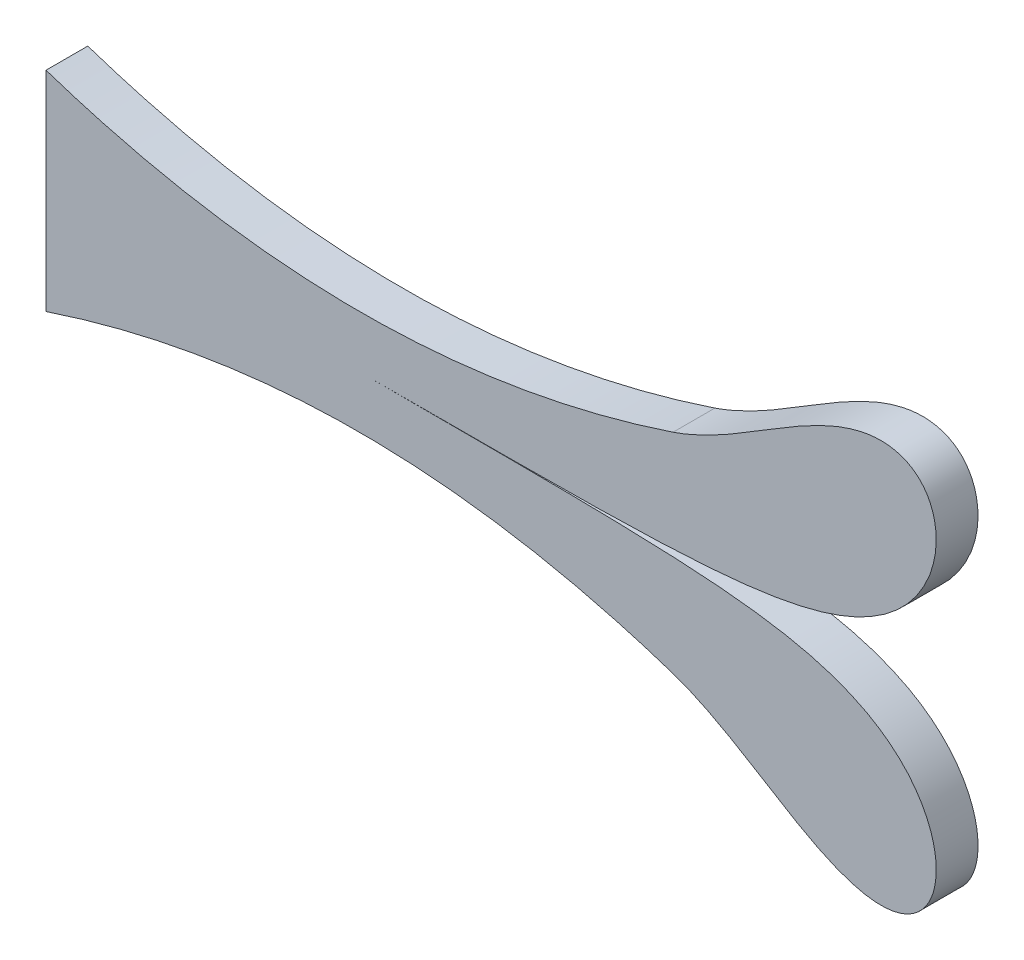
ISO-10303-21;
HEADER;
FILE_DESCRIPTION(('STEP AP214'),'2;1');
FILE_NAME('part.step','',(''),(''),'','','');
FILE_SCHEMA(('AUTOMOTIVE_DESIGN { 1 0 10303 214 1 1 1 1 }'));
ENDSEC;
DATA;
#1=APPLICATION_CONTEXT('core data for automotive mechanical design processes');
#2=APPLICATION_PROTOCOL_DEFINITION('international standard','automotive_design',2000,#1);
#3=PRODUCT_CONTEXT('',#1,'mechanical');
#4=PRODUCT('Part','Part','',(#3));
#5=PRODUCT_RELATED_PRODUCT_CATEGORY('part','',(#4));
#6=PRODUCT_DEFINITION_FORMATION('','',#4);
#7=PRODUCT_DEFINITION_CONTEXT('part definition',#1,'design');
#8=PRODUCT_DEFINITION('design','',#6,#7);
#9=PRODUCT_DEFINITION_SHAPE('','',#8);
#10=(LENGTH_UNIT() NAMED_UNIT(*) SI_UNIT(.MILLI.,.METRE.));
#11=(NAMED_UNIT(*) PLANE_ANGLE_UNIT() SI_UNIT($,.RADIAN.));
#12=(NAMED_UNIT(*) SI_UNIT($,.STERADIAN.) SOLID_ANGLE_UNIT());
#13=UNCERTAINTY_MEASURE_WITH_UNIT(LENGTH_MEASURE(1.E-05),#10,'distance_accuracy_value','');
#14=(GEOMETRIC_REPRESENTATION_CONTEXT(3) GLOBAL_UNCERTAINTY_ASSIGNED_CONTEXT((#13)) GLOBAL_UNIT_ASSIGNED_CONTEXT((#10,
#11,#12)) REPRESENTATION_CONTEXT('',''));
#15=CARTESIAN_POINT('',(0.,0.,0.));
#16=DIRECTION('',(0.,0.,1.));
#17=DIRECTION('',(1.,0.,0.));
#18=AXIS2_PLACEMENT_3D('',#15,#16,#17);
#19=CARTESIAN_POINT('',(-30.,-10.,4.));
#20=CARTESIAN_POINT('',(0.,0.,4.));
#21=CARTESIAN_POINT('',(30.,-10.,4.));
#22=B_SPLINE_CURVE_WITH_KNOTS('',2,(#19,#20,#21),.UNSPECIFIED.,.F.,.F.,(3,3),(0.,1.),.UNSPECIFIED.);
#23=DIRECTION('',(0.,0.,-1.));
#24=VECTOR('',#23,1.);
#25=SURFACE_OF_LINEAR_EXTRUSION('',#22,#24);
#26=CARTESIAN_POINT('',(-30.,-10.,0.));
#27=CARTESIAN_POINT('',(0.,0.,0.));
#28=CARTESIAN_POINT('',(30.,-10.,0.));
#29=B_SPLINE_CURVE_WITH_KNOTS('',2,(#26,#27,#28),.UNSPECIFIED.,.F.,.F.,(3,3),(0.,1.),.UNSPECIFIED.);
#30=CARTESIAN_POINT('',(-30.,-10.,0.));
#31=VERTEX_POINT('',#30);
#32=CARTESIAN_POINT('',(30.,-10.,0.));
#33=VERTEX_POINT('',#32);
#34=EDGE_CURVE('E178',#31,#33,#29,.T.);
#35=ORIENTED_EDGE('',*,*,#34,.T.);
#36=DIRECTION('',(0.,0.,-1.));
#37=VECTOR('',#36,1.);
#38=CARTESIAN_POINT('',(30.,-10.,4.));
#39=LINE('',#38,#37);
#40=CARTESIAN_POINT('',(30.,-10.,4.));
#41=VERTEX_POINT('',#40);
#42=EDGE_CURVE('E11',#41,#33,#39,.T.);
#43=ORIENTED_EDGE('',*,*,#42,.F.);
#44=CARTESIAN_POINT('',(-30.,-10.,4.));
#45=VERTEX_POINT('',#44);
#46=EDGE_CURVE('E147',#45,#41,#22,.T.);
#47=ORIENTED_EDGE('',*,*,#46,.F.);
#48=DIRECTION('',(0.,0.,-1.));
#49=VECTOR('',#48,1.);
#50=CARTESIAN_POINT('',(-30.,-10.,4.));
#51=LINE('',#50,#49);
#52=EDGE_CURVE('E121',#45,#31,#51,.T.);
#53=ORIENTED_EDGE('',*,*,#52,.T.);
#54=EDGE_LOOP('',(#35,#43,#47,#53));
#55=FACE_BOUND('',#54,.T.);
#56=ADVANCED_FACE('F45',(#55),#25,.F.);
#57=CARTESIAN_POINT('',(30.,-10.,4.));
#58=CARTESIAN_POINT('',(44.4155844155844,-14.9350649350649,4.));
#59=CARTESIAN_POINT('',(51.038961038961,-30.5194805194805,4.));
#60=CARTESIAN_POINT('',(63.3766233766233,-19.8701298701299,4.));
#61=CARTESIAN_POINT('',(59.6103896103896,-4.28571428571429,4.));
#62=CARTESIAN_POINT('',(47.6623376623376,0.,4.));
#63=CARTESIAN_POINT('',(47.7922077922077,0.,4.));
#64=CARTESIAN_POINT('',(0.,0.,4.));
#65=B_SPLINE_CURVE_WITH_KNOTS('',7,(#57,#58,#59,#60,#61,#62,#63,#64),.UNSPECIFIED.,.F.,.F.,(8,
8),(0.,1.),.UNSPECIFIED.);
#66=DIRECTION('',(0.,0.,-1.));
#67=VECTOR('',#66,1.);
#68=SURFACE_OF_LINEAR_EXTRUSION('',#65,#67);
#69=CARTESIAN_POINT('',(30.,-10.,0.));
#70=CARTESIAN_POINT('',(44.4155844155844,-14.9350649350649,0.));
#71=CARTESIAN_POINT('',(51.038961038961,-30.5194805194805,0.));
#72=CARTESIAN_POINT('',(63.3766233766233,-19.8701298701299,0.));
#73=CARTESIAN_POINT('',(59.6103896103896,-4.28571428571429,0.));
#74=CARTESIAN_POINT('',(47.6623376623376,0.,0.));
#75=CARTESIAN_POINT('',(47.7922077922077,0.,0.));
#76=CARTESIAN_POINT('',(0.,0.,0.));
#77=B_SPLINE_CURVE_WITH_KNOTS('',7,(#69,#70,#71,#72,#73,#74,#75,#76),.UNSPECIFIED.,.F.,.F.,(8,
8),(0.,1.),.UNSPECIFIED.);
#78=CARTESIAN_POINT('',(0.,0.,0.));
#79=VERTEX_POINT('',#78);
#80=EDGE_CURVE('E175',#33,#79,#77,.T.);
#81=ORIENTED_EDGE('',*,*,#80,.T.);
#82=DIRECTION('',(0.,0.,-1.));
#83=VECTOR('',#82,1.);
#84=CARTESIAN_POINT('',(0.,0.,4.));
#85=LINE('',#84,#83);
#86=CARTESIAN_POINT('',(0.,0.,4.));
#87=VERTEX_POINT('',#86);
#88=EDGE_CURVE('E55',#87,#79,#85,.T.);
#89=ORIENTED_EDGE('',*,*,#88,.F.);
#90=EDGE_CURVE('E97',#41,#87,#65,.T.);
#91=ORIENTED_EDGE('',*,*,#90,.F.);
#92=ORIENTED_EDGE('',*,*,#42,.T.);
#93=EDGE_LOOP('',(#81,#89,#91,#92));
#94=FACE_BOUND('',#93,.T.);
#95=ADVANCED_FACE('F141',(#94),#68,.F.);
#96=CARTESIAN_POINT('',(0.,0.,4.));
#97=CARTESIAN_POINT('',(47.7922077922077,0.,4.));
#98=CARTESIAN_POINT('',(47.6623376623376,0.,4.));
#99=CARTESIAN_POINT('',(59.6103896103896,4.28571428571429,4.));
#100=CARTESIAN_POINT('',(63.3766233766233,19.8701298701299,4.));
#101=CARTESIAN_POINT('',(51.038961038961,30.5194805194805,4.));
#102=CARTESIAN_POINT('',(44.4155844155844,14.9350649350649,4.));
#103=CARTESIAN_POINT('',(30.,10.,4.));
#104=B_SPLINE_CURVE_WITH_KNOTS('',7,(#96,#97,#98,#99,#100,#101,#102,#103),.UNSPECIFIED.,.F.,.F.,
(8,8),(0.,1.),.UNSPECIFIED.);
#105=DIRECTION('',(0.,0.,-1.));
#106=VECTOR('',#105,1.);
#107=SURFACE_OF_LINEAR_EXTRUSION('',#104,#106);
#108=CARTESIAN_POINT('',(0.,0.,0.));
#109=CARTESIAN_POINT('',(47.7922077922077,0.,0.));
#110=CARTESIAN_POINT('',(47.6623376623376,0.,0.));
#111=CARTESIAN_POINT('',(59.6103896103896,4.28571428571429,0.));
#112=CARTESIAN_POINT('',(63.3766233766233,19.8701298701299,0.));
#113=CARTESIAN_POINT('',(51.038961038961,30.5194805194805,0.));
#114=CARTESIAN_POINT('',(44.4155844155844,14.9350649350649,0.));
#115=CARTESIAN_POINT('',(30.,10.,0.));
#116=B_SPLINE_CURVE_WITH_KNOTS('',7,(#108,#109,#110,#111,#112,#113,#114,#115),.UNSPECIFIED.,.F.,
.F.,(8,8),(0.,1.),.UNSPECIFIED.);
#117=CARTESIAN_POINT('',(30.,10.,0.));
#118=VERTEX_POINT('',#117);
#119=EDGE_CURVE('E113',#79,#118,#116,.T.);
#120=ORIENTED_EDGE('',*,*,#119,.T.);
#121=DIRECTION('',(0.,0.,-1.));
#122=VECTOR('',#121,1.);
#123=CARTESIAN_POINT('',(30.,10.,4.));
#124=LINE('',#123,#122);
#125=CARTESIAN_POINT('',(30.,10.,4.));
#126=VERTEX_POINT('',#125);
#127=EDGE_CURVE('E110',#126,#118,#124,.T.);
#128=ORIENTED_EDGE('',*,*,#127,.F.);
#129=EDGE_CURVE('E101',#87,#126,#104,.T.);
#130=ORIENTED_EDGE('',*,*,#129,.F.);
#131=ORIENTED_EDGE('',*,*,#88,.T.);
#132=EDGE_LOOP('',(#120,#128,#130,#131));
#133=FACE_BOUND('',#132,.T.);
#134=ADVANCED_FACE('F111',(#133),#107,.F.);
#135=CARTESIAN_POINT('',(30.,10.,4.));
#136=CARTESIAN_POINT('',(0.,0.,4.));
#137=CARTESIAN_POINT('',(-30.,10.,4.));
#138=B_SPLINE_CURVE_WITH_KNOTS('',2,(#135,#136,#137),.UNSPECIFIED.,.F.,.F.,(3,3),(0.,1.),.UNSPECIFIED.);
#139=DIRECTION('',(0.,0.,-1.));
#140=VECTOR('',#139,1.);
#141=SURFACE_OF_LINEAR_EXTRUSION('',#138,#140);
#142=CARTESIAN_POINT('',(30.,10.,0.));
#143=CARTESIAN_POINT('',(0.,0.,0.));
#144=CARTESIAN_POINT('',(-30.,10.,0.));
#145=B_SPLINE_CURVE_WITH_KNOTS('',2,(#142,#143,#144),.UNSPECIFIED.,.F.,.F.,(3,3),(0.,1.),.UNSPECIFIED.);
#146=CARTESIAN_POINT('',(-30.,10.,0.));
#147=VERTEX_POINT('',#146);
#148=EDGE_CURVE('E83',#118,#147,#145,.T.);
#149=ORIENTED_EDGE('',*,*,#148,.T.);
#150=DIRECTION('',(0.,0.,-1.));
#151=VECTOR('',#150,1.);
#152=CARTESIAN_POINT('',(-30.,10.,4.));
#153=LINE('',#152,#151);
#154=CARTESIAN_POINT('',(-30.,10.,4.));
#155=VERTEX_POINT('',#154);
#156=EDGE_CURVE('E115',#155,#147,#153,.T.);
#157=ORIENTED_EDGE('',*,*,#156,.F.);
#158=EDGE_CURVE('E105',#126,#155,#138,.T.);
#159=ORIENTED_EDGE('',*,*,#158,.F.);
#160=ORIENTED_EDGE('',*,*,#127,.T.);
#161=EDGE_LOOP('',(#149,#157,#159,#160));
#162=FACE_BOUND('',#161,.T.);
#163=ADVANCED_FACE('F117',(#162),#141,.F.);
#164=CARTESIAN_POINT('',(-30.,10.,4.));
#165=DIRECTION('',(1.,0.,0.));
#166=DIRECTION('',(0.,0.,-1.));
#167=AXIS2_PLACEMENT_3D('',#164,#165,#166);
#168=PLANE('',#167);
#169=DIRECTION('',(0.,-1.,0.));
#170=VECTOR('',#169,1.);
#171=CARTESIAN_POINT('',(-30.,10.,0.));
#172=LINE('',#171,#170);
#173=EDGE_CURVE('E89',#147,#31,#172,.T.);
#174=ORIENTED_EDGE('',*,*,#173,.T.);
#175=ORIENTED_EDGE('',*,*,#52,.F.);
#176=DIRECTION('',(0.,-1.,0.));
#177=VECTOR('',#176,1.);
#178=CARTESIAN_POINT('',(-30.,10.,4.));
#179=LINE('',#178,#177);
#180=EDGE_CURVE('E63',#155,#45,#179,.T.);
#181=ORIENTED_EDGE('',*,*,#180,.F.);
#182=ORIENTED_EDGE('',*,*,#156,.T.);
#183=EDGE_LOOP('',(#174,#175,#181,#182));
#184=FACE_BOUND('',#183,.T.);
#185=ADVANCED_FACE('F138',(#184),#168,.F.);
#186=CARTESIAN_POINT('',(0.,-5.,4.));
#187=DIRECTION('',(0.,0.,-1.));
#188=DIRECTION('',(-1.,0.,0.));
#189=AXIS2_PLACEMENT_3D('',#186,#187,#188);
#190=PLANE('',#189);
#191=ORIENTED_EDGE('',*,*,#46,.T.);
#192=ORIENTED_EDGE('',*,*,#90,.T.);
#193=ORIENTED_EDGE('',*,*,#129,.T.);
#194=ORIENTED_EDGE('',*,*,#158,.T.);
#195=ORIENTED_EDGE('',*,*,#180,.T.);
#196=EDGE_LOOP('',(#191,#192,#193,#194,#195));
#197=FACE_BOUND('',#196,.T.);
#198=ADVANCED_FACE('F103',(#197),#190,.F.);
#199=CARTESIAN_POINT('',(0.,-5.,0.));
#200=DIRECTION('',(0.,0.,-1.));
#201=DIRECTION('',(-1.,0.,0.));
#202=AXIS2_PLACEMENT_3D('',#199,#200,#201);
#203=PLANE('',#202);
#204=ORIENTED_EDGE('',*,*,#34,.F.);
#205=ORIENTED_EDGE('',*,*,#173,.F.);
#206=ORIENTED_EDGE('',*,*,#148,.F.);
#207=ORIENTED_EDGE('',*,*,#119,.F.);
#208=ORIENTED_EDGE('',*,*,#80,.F.);
#209=EDGE_LOOP('',(#204,#205,#206,#207,#208));
#210=FACE_BOUND('',#209,.T.);
#211=ADVANCED_FACE('F174',(#210),#203,.T.);
#212=CLOSED_SHELL('',(#56,#95,#134,#163,#185,#198,#211));
#213=MANIFOLD_SOLID_BREP('B2',#212);
#214=ADVANCED_BREP_SHAPE_REPRESENTATION('',(#18,#213),#14);
#215=SHAPE_DEFINITION_REPRESENTATION(#9,#214);
ENDSEC;
END-ISO-10303-21;
